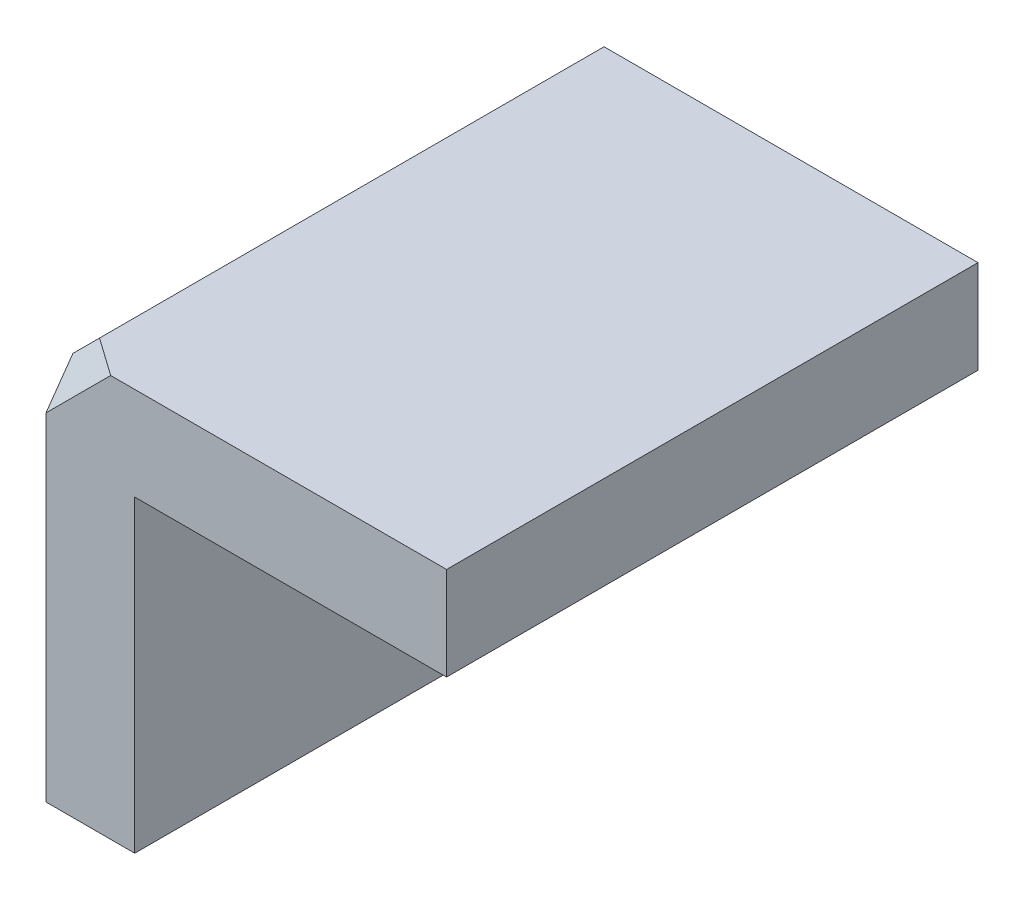
ISO-10303-21;
HEADER;
FILE_DESCRIPTION(('STEP AP214'),'2;1');
FILE_NAME('part.step','',(''),(''),'','','');
FILE_SCHEMA(('AUTOMOTIVE_DESIGN { 1 0 10303 214 1 1 1 1 }'));
ENDSEC;
DATA;
#1=APPLICATION_CONTEXT('core data for automotive mechanical design processes');
#2=APPLICATION_PROTOCOL_DEFINITION('international standard','automotive_design',2000,#1);
#3=PRODUCT_CONTEXT('',#1,'mechanical');
#4=PRODUCT('Part','Part','',(#3));
#5=PRODUCT_RELATED_PRODUCT_CATEGORY('part','',(#4));
#6=PRODUCT_DEFINITION_FORMATION('','',#4);
#7=PRODUCT_DEFINITION_CONTEXT('part definition',#1,'design');
#8=PRODUCT_DEFINITION('design','',#6,#7);
#9=PRODUCT_DEFINITION_SHAPE('','',#8);
#10=(LENGTH_UNIT() NAMED_UNIT(*) SI_UNIT(.MILLI.,.METRE.));
#11=(NAMED_UNIT(*) PLANE_ANGLE_UNIT() SI_UNIT($,.RADIAN.));
#12=(NAMED_UNIT(*) SI_UNIT($,.STERADIAN.) SOLID_ANGLE_UNIT());
#13=UNCERTAINTY_MEASURE_WITH_UNIT(LENGTH_MEASURE(1.E-05),#10,'distance_accuracy_value','');
#14=(GEOMETRIC_REPRESENTATION_CONTEXT(3) GLOBAL_UNCERTAINTY_ASSIGNED_CONTEXT((#13)) GLOBAL_UNIT_ASSIGNED_CONTEXT((#10,
#11,#12)) REPRESENTATION_CONTEXT('',''));
#15=CARTESIAN_POINT('',(0.,0.,0.));
#16=DIRECTION('',(0.,0.,1.));
#17=DIRECTION('',(1.,0.,0.));
#18=AXIS2_PLACEMENT_3D('',#15,#16,#17);
#19=CARTESIAN_POINT('',(75.3788778492679,-17.5417487850531,-50.));
#20=DIRECTION('',(1.,0.,0.));
#21=DIRECTION('',(0.,0.,-1.));
#22=AXIS2_PLACEMENT_3D('',#19,#20,#21);
#23=PLANE('',#22);
#24=DIRECTION('',(0.,1.,0.));
#25=VECTOR('',#24,1.);
#26=CARTESIAN_POINT('',(75.3788778492679,-17.5417487850531,50.));
#27=LINE('',#26,#25);
#28=CARTESIAN_POINT('',(75.3788778492679,-17.5417487850531,50.));
#29=VERTEX_POINT('',#28);
#30=CARTESIAN_POINT('',(75.3788778492679,0.,50.));
#31=VERTEX_POINT('',#30);
#32=EDGE_CURVE('E135',#29,#31,#27,.T.);
#33=ORIENTED_EDGE('',*,*,#32,.F.);
#34=DIRECTION('',(0.,0.,1.));
#35=VECTOR('',#34,1.);
#36=CARTESIAN_POINT('',(75.3788778492679,-17.5417487850531,-50.));
#37=LINE('',#36,#35);
#38=CARTESIAN_POINT('',(75.3788778492679,-17.5417487850531,-50.));
#39=VERTEX_POINT('',#38);
#40=EDGE_CURVE('E44',#39,#29,#37,.T.);
#41=ORIENTED_EDGE('',*,*,#40,.F.);
#42=DIRECTION('',(0.,1.,0.));
#43=VECTOR('',#42,1.);
#44=CARTESIAN_POINT('',(75.3788778492679,-17.5417487850531,-50.));
#45=LINE('',#44,#43);
#46=CARTESIAN_POINT('',(75.3788778492679,0.,-50.));
#47=VERTEX_POINT('',#46);
#48=EDGE_CURVE('E149',#39,#47,#45,.T.);
#49=ORIENTED_EDGE('',*,*,#48,.T.);
#50=DIRECTION('',(0.,0.,1.));
#51=VECTOR('',#50,1.);
#52=CARTESIAN_POINT('',(75.3788778492679,0.,-50.));
#53=LINE('',#52,#51);
#54=EDGE_CURVE('E88',#47,#31,#53,.T.);
#55=ORIENTED_EDGE('',*,*,#54,.T.);
#56=EDGE_LOOP('',(#33,#41,#49,#55));
#57=FACE_BOUND('',#56,.T.);
#58=ADVANCED_FACE('F37',(#57),#23,.T.);
#59=CARTESIAN_POINT('',(16.6971882048531,-17.5417487850531,-50.));
#60=DIRECTION('',(0.,-1.,0.));
#61=DIRECTION('',(0.,0.,-1.));
#62=AXIS2_PLACEMENT_3D('',#59,#60,#61);
#63=PLANE('',#62);
#64=DIRECTION('',(1.,0.,0.));
#65=VECTOR('',#64,1.);
#66=CARTESIAN_POINT('',(16.6971882048531,-17.5417487850531,50.));
#67=LINE('',#66,#65);
#68=CARTESIAN_POINT('',(16.6971882048531,-17.5417487850531,50.));
#69=VERTEX_POINT('',#68);
#70=EDGE_CURVE('E146',#69,#29,#67,.T.);
#71=ORIENTED_EDGE('',*,*,#70,.F.);
#72=DIRECTION('',(0.,0.,1.));
#73=VECTOR('',#72,1.);
#74=CARTESIAN_POINT('',(16.6971882048531,-17.5417487850531,-50.));
#75=LINE('',#74,#73);
#76=CARTESIAN_POINT('',(16.6971882048531,-17.5417487850531,-50.));
#77=VERTEX_POINT('',#76);
#78=EDGE_CURVE('E115',#77,#69,#75,.T.);
#79=ORIENTED_EDGE('',*,*,#78,.F.);
#80=DIRECTION('',(1.,0.,0.));
#81=VECTOR('',#80,1.);
#82=CARTESIAN_POINT('',(16.6971882048531,-17.5417487850531,-50.));
#83=LINE('',#82,#81);
#84=EDGE_CURVE('E124',#77,#39,#83,.T.);
#85=ORIENTED_EDGE('',*,*,#84,.T.);
#86=ORIENTED_EDGE('',*,*,#40,.T.);
#87=EDGE_LOOP('',(#71,#79,#85,#86));
#88=FACE_BOUND('',#87,.T.);
#89=ADVANCED_FACE('F164',(#88),#63,.T.);
#90=CARTESIAN_POINT('',(16.6971882048531,-75.5918342669629,-50.));
#91=DIRECTION('',(1.,0.,0.));
#92=DIRECTION('',(0.,0.,-1.));
#93=AXIS2_PLACEMENT_3D('',#90,#91,#92);
#94=PLANE('',#93);
#95=DIRECTION('',(0.,1.,0.));
#96=VECTOR('',#95,1.);
#97=CARTESIAN_POINT('',(16.6971882048531,-75.5918342669629,50.));
#98=LINE('',#97,#96);
#99=CARTESIAN_POINT('',(16.6971882048531,-75.5918342669629,50.));
#100=VERTEX_POINT('',#99);
#101=EDGE_CURVE('E110',#100,#69,#98,.T.);
#102=ORIENTED_EDGE('',*,*,#101,.F.);
#103=DIRECTION('',(0.,0.,1.));
#104=VECTOR('',#103,1.);
#105=CARTESIAN_POINT('',(16.6971882048531,-75.5918342669629,-50.));
#106=LINE('',#105,#104);
#107=CARTESIAN_POINT('',(16.6971882048531,-75.5918342669629,-50.));
#108=VERTEX_POINT('',#107);
#109=EDGE_CURVE('E104',#108,#100,#106,.T.);
#110=ORIENTED_EDGE('',*,*,#109,.F.);
#111=DIRECTION('',(0.,1.,0.));
#112=VECTOR('',#111,1.);
#113=CARTESIAN_POINT('',(16.6971882048531,-75.5918342669629,-50.));
#114=LINE('',#113,#112);
#115=EDGE_CURVE('E107',#108,#77,#114,.T.);
#116=ORIENTED_EDGE('',*,*,#115,.T.);
#117=ORIENTED_EDGE('',*,*,#78,.T.);
#118=EDGE_LOOP('',(#102,#110,#116,#117));
#119=FACE_BOUND('',#118,.T.);
#120=ADVANCED_FACE('F106',(#119),#94,.T.);
#121=CARTESIAN_POINT('',(0.,-75.5918342669629,-50.));
#122=DIRECTION('',(0.,-1.,0.));
#123=DIRECTION('',(0.,0.,-1.));
#124=AXIS2_PLACEMENT_3D('',#121,#122,#123);
#125=PLANE('',#124);
#126=DIRECTION('',(1.,0.,0.));
#127=VECTOR('',#126,1.);
#128=CARTESIAN_POINT('',(0.,-75.5918342669629,50.));
#129=LINE('',#128,#127);
#130=CARTESIAN_POINT('',(0.,-75.5918342669629,50.));
#131=VERTEX_POINT('',#130);
#132=EDGE_CURVE('E143',#131,#100,#129,.T.);
#133=ORIENTED_EDGE('',*,*,#132,.F.);
#134=DIRECTION('',(0.,0.,1.));
#135=VECTOR('',#134,1.);
#136=CARTESIAN_POINT('',(0.,-75.5918342669629,-50.));
#137=LINE('',#136,#135);
#138=CARTESIAN_POINT('',(0.,-75.5918342669629,-50.));
#139=VERTEX_POINT('',#138);
#140=EDGE_CURVE('E116',#139,#131,#137,.T.);
#141=ORIENTED_EDGE('',*,*,#140,.F.);
#142=DIRECTION('',(1.,0.,0.));
#143=VECTOR('',#142,1.);
#144=CARTESIAN_POINT('',(0.,-75.5918342669629,-50.));
#145=LINE('',#144,#143);
#146=EDGE_CURVE('E122',#139,#108,#145,.T.);
#147=ORIENTED_EDGE('',*,*,#146,.T.);
#148=ORIENTED_EDGE('',*,*,#109,.T.);
#149=EDGE_LOOP('',(#133,#141,#147,#148));
#150=FACE_BOUND('',#149,.T.);
#151=ADVANCED_FACE('F126',(#150),#125,.T.);
#152=CARTESIAN_POINT('',(0.,-5.01375486012896,-50.));
#153=DIRECTION('',(-1.,0.,0.));
#154=DIRECTION('',(0.,-1.,0.));
#155=AXIS2_PLACEMENT_3D('',#152,#153,#154);
#156=PLANE('',#155);
#157=DIRECTION('',(0.,-0.816496580927727,0.577350269189625));
#158=VECTOR('',#157,1.);
#159=CARTESIAN_POINT('',(0.,39.7416500093912,13.2937005559744));
#160=LINE('',#159,#158);
#161=CARTESIAN_POINT('',(0.,-5.01375486012896,44.9405508339615));
#162=VERTEX_POINT('',#161);
#163=CARTESIAN_POINT('',(0.,-12.1688964888779,50.));
#164=VERTEX_POINT('',#163);
#165=EDGE_CURVE('E51',#162,#164,#160,.T.);
#166=ORIENTED_EDGE('',*,*,#165,.F.);
#167=DIRECTION('',(0.,0.,1.));
#168=VECTOR('',#167,1.);
#169=CARTESIAN_POINT('',(0.,-5.01375486012896,-50.));
#170=LINE('',#169,#168);
#171=CARTESIAN_POINT('',(0.,-5.01375486012896,-50.));
#172=VERTEX_POINT('',#171);
#173=EDGE_CURVE('E153',#172,#162,#170,.T.);
#174=ORIENTED_EDGE('',*,*,#173,.F.);
#175=DIRECTION('',(0.,-1.,0.));
#176=VECTOR('',#175,1.);
#177=CARTESIAN_POINT('',(0.,-5.01375486012896,-50.));
#178=LINE('',#177,#176);
#179=EDGE_CURVE('E128',#172,#139,#178,.T.);
#180=ORIENTED_EDGE('',*,*,#179,.T.);
#181=ORIENTED_EDGE('',*,*,#140,.T.);
#182=DIRECTION('',(0.,-1.,0.));
#183=VECTOR('',#182,1.);
#184=CARTESIAN_POINT('',(0.,-5.01375486012896,50.));
#185=LINE('',#184,#183);
#186=EDGE_CURVE('E141',#164,#131,#185,.T.);
#187=ORIENTED_EDGE('',*,*,#186,.F.);
#188=EDGE_LOOP('',(#166,#174,#180,#181,#187));
#189=FACE_BOUND('',#188,.T.);
#190=ADVANCED_FACE('F177',(#189),#156,.T.);
#191=CARTESIAN_POINT('',(5.01375486012887,0.,-50.));
#192=DIRECTION('',(-0.707106781186554,0.707106781186541,0.));
#193=DIRECTION('',(-0.707106781186541,-0.707106781186554,0.));
#194=AXIS2_PLACEMENT_3D('',#191,#192,#193);
#195=PLANE('',#194);
#196=DIRECTION('',(0.707106781186546,0.707106781186549,0.));
#197=VECTOR('',#196,1.);
#198=CARTESIAN_POINT('',(-35.289039703417,-40.3027945635461,44.9405508339615));
#199=LINE('',#198,#197);
#200=CARTESIAN_POINT('',(5.01375486012895,0.,44.9405508339615));
#201=VERTEX_POINT('',#200);
#202=EDGE_CURVE('E270',#162,#201,#199,.T.);
#203=ORIENTED_EDGE('',*,*,#202,.T.);
#204=DIRECTION('',(0.,0.,1.));
#205=VECTOR('',#204,1.);
#206=CARTESIAN_POINT('',(5.01375486012887,0.,-50.));
#207=LINE('',#206,#205);
#208=CARTESIAN_POINT('',(5.01375486012887,0.,-50.));
#209=VERTEX_POINT('',#208);
#210=EDGE_CURVE('E156',#209,#201,#207,.T.);
#211=ORIENTED_EDGE('',*,*,#210,.F.);
#212=DIRECTION('',(-0.707106781186541,-0.707106781186554,0.));
#213=VECTOR('',#212,1.);
#214=CARTESIAN_POINT('',(5.01375486012887,0.,-50.));
#215=LINE('',#214,#213);
#216=EDGE_CURVE('E130',#209,#172,#215,.T.);
#217=ORIENTED_EDGE('',*,*,#216,.T.);
#218=ORIENTED_EDGE('',*,*,#173,.T.);
#219=EDGE_LOOP('',(#203,#211,#217,#218));
#220=FACE_BOUND('',#219,.T.);
#221=ADVANCED_FACE('F180',(#220),#195,.T.);
#222=CARTESIAN_POINT('',(5.01375486012887,0.,-50.));
#223=DIRECTION('',(0.,1.,0.));
#224=DIRECTION('',(0.,0.,1.));
#225=AXIS2_PLACEMENT_3D('',#222,#223,#224);
#226=PLANE('',#225);
#227=DIRECTION('',(-0.816496580927726,0.,-0.577350269189626));
#228=VECTOR('',#227,1.);
#229=CARTESIAN_POINT('',(-39.7416500093913,0.,13.2937005559743));
#230=LINE('',#229,#228);
#231=CARTESIAN_POINT('',(12.1688964888778,0.,50.));
#232=VERTEX_POINT('',#231);
#233=EDGE_CURVE('E161',#232,#201,#230,.T.);
#234=ORIENTED_EDGE('',*,*,#233,.F.);
#235=DIRECTION('',(-1.,0.,0.));
#236=VECTOR('',#235,1.);
#237=CARTESIAN_POINT('',(5.01375486012887,0.,50.));
#238=LINE('',#237,#236);
#239=EDGE_CURVE('E138',#31,#232,#238,.T.);
#240=ORIENTED_EDGE('',*,*,#239,.F.);
#241=ORIENTED_EDGE('',*,*,#54,.F.);
#242=DIRECTION('',(-1.,0.,0.));
#243=VECTOR('',#242,1.);
#244=CARTESIAN_POINT('',(5.01375486012887,0.,-50.));
#245=LINE('',#244,#243);
#246=EDGE_CURVE('E275',#47,#209,#245,.T.);
#247=ORIENTED_EDGE('',*,*,#246,.T.);
#248=ORIENTED_EDGE('',*,*,#210,.T.);
#249=EDGE_LOOP('',(#234,#240,#241,#247,#248));
#250=FACE_BOUND('',#249,.T.);
#251=ADVANCED_FACE('F159',(#250),#226,.T.);
#252=CARTESIAN_POINT('',(0.,0.,-50.));
#253=DIRECTION('',(0.,0.,-1.));
#254=DIRECTION('',(-1.,0.,0.));
#255=AXIS2_PLACEMENT_3D('',#252,#253,#254);
#256=PLANE('',#255);
#257=ORIENTED_EDGE('',*,*,#48,.F.);
#258=ORIENTED_EDGE('',*,*,#84,.F.);
#259=ORIENTED_EDGE('',*,*,#115,.F.);
#260=ORIENTED_EDGE('',*,*,#146,.F.);
#261=ORIENTED_EDGE('',*,*,#179,.F.);
#262=ORIENTED_EDGE('',*,*,#216,.F.);
#263=ORIENTED_EDGE('',*,*,#246,.F.);
#264=EDGE_LOOP('',(#257,#258,#259,#260,#261,#262,#263));
#265=FACE_BOUND('',#264,.T.);
#266=ADVANCED_FACE('F120',(#265),#256,.T.);
#267=CARTESIAN_POINT('',(0.,0.,50.));
#268=DIRECTION('',(0.,0.,-1.));
#269=DIRECTION('',(-1.,0.,0.));
#270=AXIS2_PLACEMENT_3D('',#267,#268,#269);
#271=PLANE('',#270);
#272=ORIENTED_EDGE('',*,*,#239,.T.);
#273=DIRECTION('',(-0.707106781186546,-0.707106781186549,0.));
#274=VECTOR('',#273,1.);
#275=CARTESIAN_POINT('',(6.08444824443893,-6.08444824443891,50.));
#276=LINE('',#275,#274);
#277=EDGE_CURVE('E11',#232,#164,#276,.T.);
#278=ORIENTED_EDGE('',*,*,#277,.T.);
#279=ORIENTED_EDGE('',*,*,#186,.T.);
#280=ORIENTED_EDGE('',*,*,#132,.T.);
#281=ORIENTED_EDGE('',*,*,#101,.T.);
#282=ORIENTED_EDGE('',*,*,#70,.T.);
#283=ORIENTED_EDGE('',*,*,#32,.T.);
#284=EDGE_LOOP('',(#272,#278,#279,#280,#281,#282,#283));
#285=FACE_BOUND('',#284,.T.);
#286=ADVANCED_FACE('F163',(#285),#271,.F.);
#287=CARTESIAN_POINT('',(-35.289039703417,-40.3027945635461,44.9405508339615));
#288=DIRECTION('',(0.500000000000001,-0.499999999999999,-0.707106781186548));
#289=DIRECTION('',(-0.816496580927726,0.,-0.577350269189626));
#290=AXIS2_PLACEMENT_3D('',#287,#288,#289);
#291=PLANE('',#290);
#292=ORIENTED_EDGE('',*,*,#165,.T.);
#293=ORIENTED_EDGE('',*,*,#277,.F.);
#294=ORIENTED_EDGE('',*,*,#233,.T.);
#295=ORIENTED_EDGE('',*,*,#202,.F.);
#296=EDGE_LOOP('',(#292,#293,#294,#295));
#297=FACE_BOUND('',#296,.T.);
#298=ADVANCED_FACE('F191',(#297),#291,.F.);
#299=CLOSED_SHELL('',(#58,#89,#120,#151,#190,#221,#251,#266,#286,#298));
#300=MANIFOLD_SOLID_BREP('B2',#299);
#301=ADVANCED_BREP_SHAPE_REPRESENTATION('',(#18,#300),#14);
#302=SHAPE_DEFINITION_REPRESENTATION(#9,#301);
ENDSEC;
END-ISO-10303-21;
